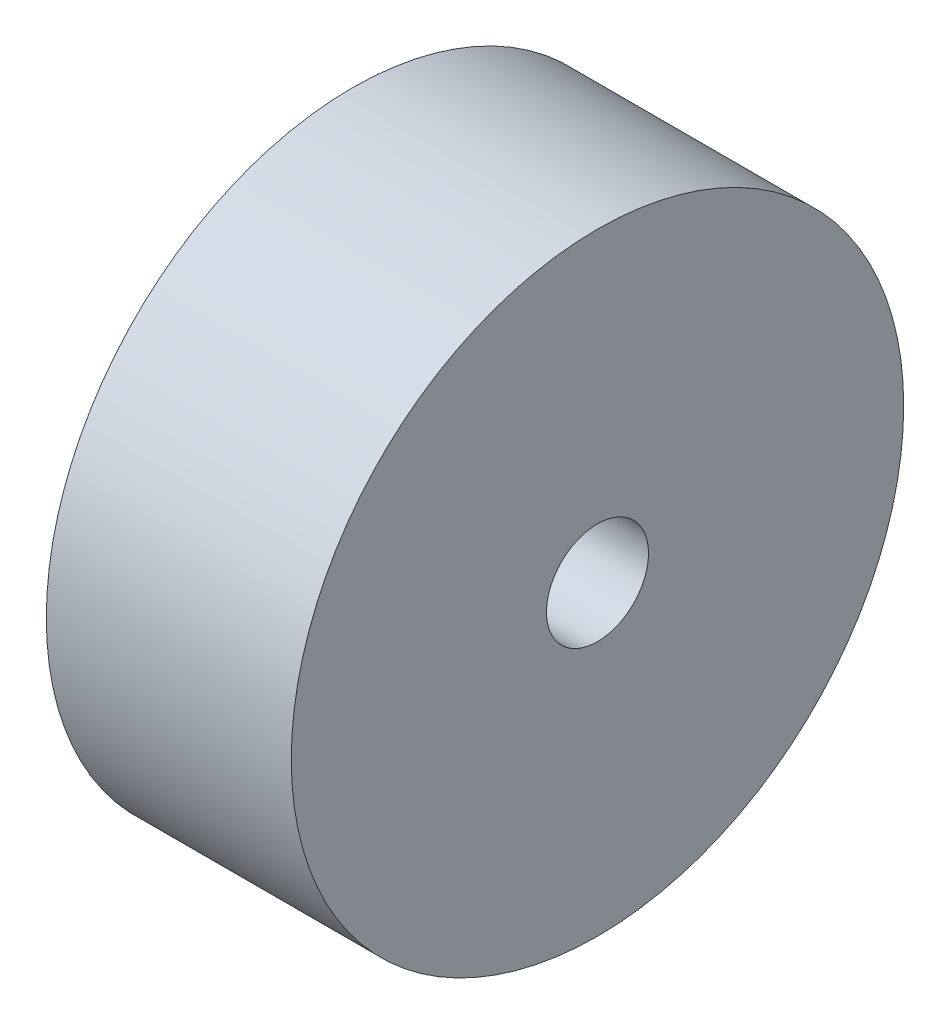
ISO-10303-21;
HEADER;
FILE_DESCRIPTION(('STEP AP214'),'2;1');
FILE_NAME('part.step','',(''),(''),'','','');
FILE_SCHEMA(('AUTOMOTIVE_DESIGN { 1 0 10303 214 1 1 1 1 }'));
ENDSEC;
DATA;
#1=APPLICATION_CONTEXT('core data for automotive mechanical design processes');
#2=APPLICATION_PROTOCOL_DEFINITION('international standard','automotive_design',2000,#1);
#3=PRODUCT_CONTEXT('',#1,'mechanical');
#4=PRODUCT('Part','Part','',(#3));
#5=PRODUCT_RELATED_PRODUCT_CATEGORY('part','',(#4));
#6=PRODUCT_DEFINITION_FORMATION('','',#4);
#7=PRODUCT_DEFINITION_CONTEXT('part definition',#1,'design');
#8=PRODUCT_DEFINITION('design','',#6,#7);
#9=PRODUCT_DEFINITION_SHAPE('','',#8);
#10=(LENGTH_UNIT() NAMED_UNIT(*) SI_UNIT(.MILLI.,.METRE.));
#11=(NAMED_UNIT(*) PLANE_ANGLE_UNIT() SI_UNIT($,.RADIAN.));
#12=(NAMED_UNIT(*) SI_UNIT($,.STERADIAN.) SOLID_ANGLE_UNIT());
#13=UNCERTAINTY_MEASURE_WITH_UNIT(LENGTH_MEASURE(1.E-05),#10,'distance_accuracy_value','');
#14=(GEOMETRIC_REPRESENTATION_CONTEXT(3) GLOBAL_UNCERTAINTY_ASSIGNED_CONTEXT((#13)) GLOBAL_UNIT_ASSIGNED_CONTEXT((#10,
#11,#12)) REPRESENTATION_CONTEXT('',''));
#15=CARTESIAN_POINT('',(0.,0.,0.));
#16=DIRECTION('',(0.,0.,1.));
#17=DIRECTION('',(1.,0.,0.));
#18=AXIS2_PLACEMENT_3D('',#15,#16,#17);
#19=CARTESIAN_POINT('',(30.,0.,0.));
#20=DIRECTION('',(1.,0.,0.));
#21=DIRECTION('',(0.,0.,-1.));
#22=AXIS2_PLACEMENT_3D('',#19,#20,#21);
#23=PLANE('',#22);
#24=CARTESIAN_POINT('',(30.,0.,0.));
#25=DIRECTION('',(1.,0.,0.));
#26=DIRECTION('',(0.,0.,-1.));
#27=AXIS2_PLACEMENT_3D('',#24,#25,#26);
#28=CIRCLE('',#27,75.);
#29=CARTESIAN_POINT('',(30.,0.,-75.));
#30=VERTEX_POINT('',#29);
#31=EDGE_CURVE('E10',#30,#30,#28,.T.);
#32=ORIENTED_EDGE('',*,*,#31,.T.);
#33=EDGE_LOOP('',(#32));
#34=FACE_BOUND('',#33,.T.);
#35=CARTESIAN_POINT('',(30.,0.,0.));
#36=DIRECTION('',(1.,0.,0.));
#37=DIRECTION('',(0.,0.,-1.));
#38=AXIS2_PLACEMENT_3D('',#35,#36,#37);
#39=CIRCLE('',#38,12.5);
#40=CARTESIAN_POINT('',(30.,0.,-12.5));
#41=VERTEX_POINT('',#40);
#42=EDGE_CURVE('E50',#41,#41,#39,.T.);
#43=ORIENTED_EDGE('',*,*,#42,.F.);
#44=EDGE_LOOP('',(#43));
#45=FACE_BOUND('',#44,.T.);
#46=ADVANCED_FACE('F37',(#34,#45),#23,.T.);
#47=CARTESIAN_POINT('',(-30.,0.,0.));
#48=DIRECTION('',(1.,0.,0.));
#49=DIRECTION('',(0.,0.,-1.));
#50=AXIS2_PLACEMENT_3D('',#47,#48,#49);
#51=PLANE('',#50);
#52=CARTESIAN_POINT('',(-30.,0.,0.));
#53=DIRECTION('',(1.,0.,0.));
#54=DIRECTION('',(0.,0.,-1.));
#55=AXIS2_PLACEMENT_3D('',#52,#53,#54);
#56=CIRCLE('',#55,75.);
#57=CARTESIAN_POINT('',(-30.,0.,-75.));
#58=VERTEX_POINT('',#57);
#59=EDGE_CURVE('E41',#58,#58,#56,.T.);
#60=ORIENTED_EDGE('',*,*,#59,.F.);
#61=EDGE_LOOP('',(#60));
#62=FACE_BOUND('',#61,.T.);
#63=CARTESIAN_POINT('',(-30.,0.,0.));
#64=DIRECTION('',(1.,0.,0.));
#65=DIRECTION('',(0.,0.,-1.));
#66=AXIS2_PLACEMENT_3D('',#63,#64,#65);
#67=CIRCLE('',#66,12.5);
#68=CARTESIAN_POINT('',(-30.,0.,-12.5));
#69=VERTEX_POINT('',#68);
#70=EDGE_CURVE('E52',#69,#69,#67,.T.);
#71=ORIENTED_EDGE('',*,*,#70,.T.);
#72=EDGE_LOOP('',(#71));
#73=FACE_BOUND('',#72,.T.);
#74=ADVANCED_FACE('F64',(#62,#73),#51,.F.);
#75=CARTESIAN_POINT('',(30.,0.,0.));
#76=DIRECTION('',(-1.,0.,0.));
#77=DIRECTION('',(0.,0.,1.));
#78=AXIS2_PLACEMENT_3D('',#75,#76,#77);
#79=CYLINDRICAL_SURFACE('',#78,75.);
#80=ORIENTED_EDGE('',*,*,#31,.F.);
#81=EDGE_LOOP('',(#80));
#82=FACE_BOUND('',#81,.T.);
#83=ORIENTED_EDGE('',*,*,#59,.T.);
#84=EDGE_LOOP('',(#83));
#85=FACE_BOUND('',#84,.T.);
#86=ADVANCED_FACE('F39',(#82,#85),#79,.T.);
#87=CARTESIAN_POINT('',(30.,0.,0.));
#88=DIRECTION('',(-1.,0.,0.));
#89=DIRECTION('',(0.,0.,1.));
#90=AXIS2_PLACEMENT_3D('',#87,#88,#89);
#91=CYLINDRICAL_SURFACE('',#90,12.5);
#92=ORIENTED_EDGE('',*,*,#42,.T.);
#93=EDGE_LOOP('',(#92));
#94=FACE_BOUND('',#93,.T.);
#95=ORIENTED_EDGE('',*,*,#70,.F.);
#96=EDGE_LOOP('',(#95));
#97=FACE_BOUND('',#96,.T.);
#98=ADVANCED_FACE('F60',(#94,#97),#91,.F.);
#99=CLOSED_SHELL('',(#46,#74,#86,#98));
#100=MANIFOLD_SOLID_BREP('B2',#99);
#101=ADVANCED_BREP_SHAPE_REPRESENTATION('',(#18,#100),#14);
#102=SHAPE_DEFINITION_REPRESENTATION(#9,#101);
ENDSEC;
END-ISO-10303-21;
